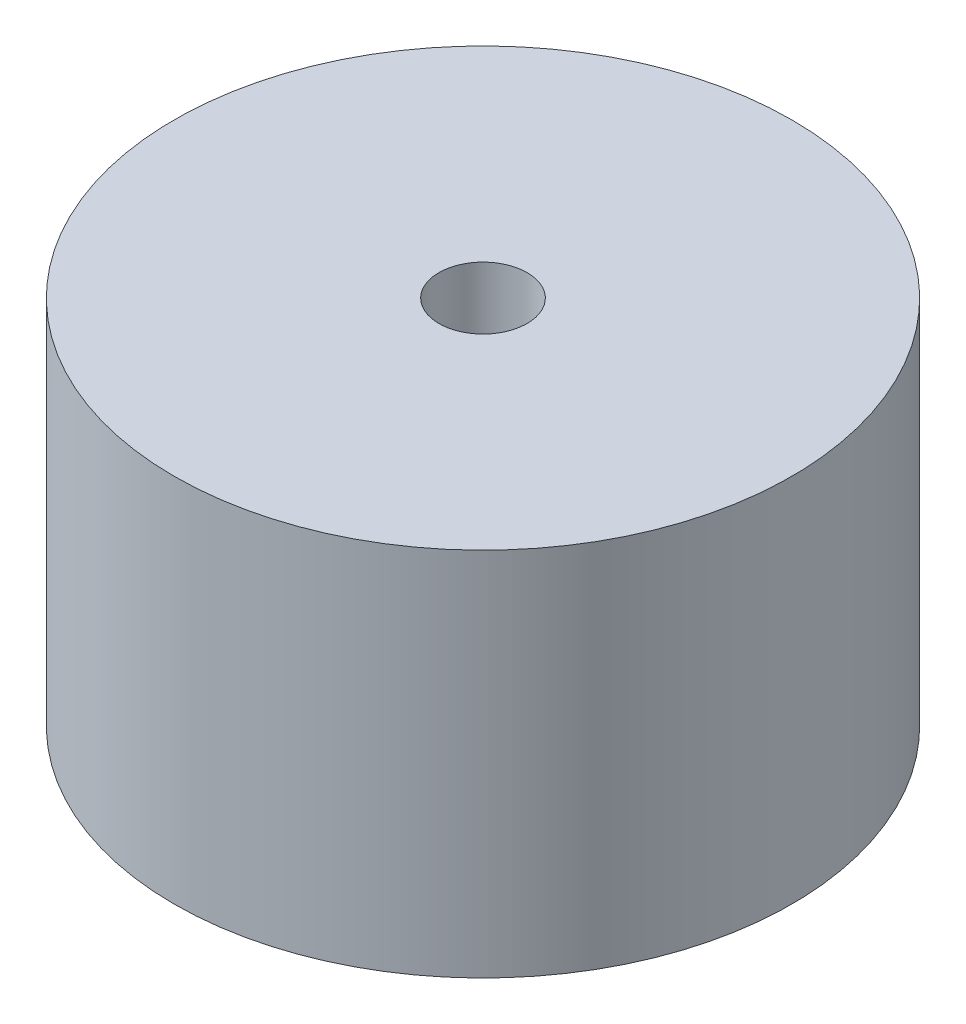
ISO-10303-21;
HEADER;
FILE_DESCRIPTION(('STEP AP214'),'2;1');
FILE_NAME('part.step','',(''),(''),'','','');
FILE_SCHEMA(('AUTOMOTIVE_DESIGN { 1 0 10303 214 1 1 1 1 }'));
ENDSEC;
DATA;
#1=APPLICATION_CONTEXT('core data for automotive mechanical design processes');
#2=APPLICATION_PROTOCOL_DEFINITION('international standard','automotive_design',2000,#1);
#3=PRODUCT_CONTEXT('',#1,'mechanical');
#4=PRODUCT('Part','Part','',(#3));
#5=PRODUCT_RELATED_PRODUCT_CATEGORY('part','',(#4));
#6=PRODUCT_DEFINITION_FORMATION('','',#4);
#7=PRODUCT_DEFINITION_CONTEXT('part definition',#1,'design');
#8=PRODUCT_DEFINITION('design','',#6,#7);
#9=PRODUCT_DEFINITION_SHAPE('','',#8);
#10=(LENGTH_UNIT() NAMED_UNIT(*) SI_UNIT(.MILLI.,.METRE.));
#11=(NAMED_UNIT(*) PLANE_ANGLE_UNIT() SI_UNIT($,.RADIAN.));
#12=(NAMED_UNIT(*) SI_UNIT($,.STERADIAN.) SOLID_ANGLE_UNIT());
#13=UNCERTAINTY_MEASURE_WITH_UNIT(LENGTH_MEASURE(1.E-05),#10,'distance_accuracy_value','');
#14=(GEOMETRIC_REPRESENTATION_CONTEXT(3) GLOBAL_UNCERTAINTY_ASSIGNED_CONTEXT((#13)) GLOBAL_UNIT_ASSIGNED_CONTEXT((#10,
#11,#12)) REPRESENTATION_CONTEXT('',''));
#15=CARTESIAN_POINT('',(0.,0.,0.));
#16=DIRECTION('',(0.,0.,1.));
#17=DIRECTION('',(1.,0.,0.));
#18=AXIS2_PLACEMENT_3D('',#15,#16,#17);
#19=CARTESIAN_POINT('',(0.489666327297885,21.,0.));
#20=DIRECTION('',(0.,1.,0.));
#21=DIRECTION('',(0.,0.,1.));
#22=AXIS2_PLACEMENT_3D('',#19,#20,#21);
#23=PLANE('',#22);
#24=CARTESIAN_POINT('',(0.489666327297885,21.,0.));
#25=DIRECTION('',(0.,1.,0.));
#26=DIRECTION('',(0.,0.,1.));
#27=AXIS2_PLACEMENT_3D('',#24,#25,#26);
#28=CIRCLE('',#27,17.5);
#29=CARTESIAN_POINT('',(0.489666327297885,21.,-17.5));
#30=VERTEX_POINT('',#29);
#31=EDGE_CURVE('E10',#30,#30,#28,.T.);
#32=ORIENTED_EDGE('',*,*,#31,.T.);
#33=EDGE_LOOP('',(#32));
#34=FACE_BOUND('',#33,.T.);
#35=CARTESIAN_POINT('',(0.489666327297885,21.,0.));
#36=DIRECTION('',(0.,1.,0.));
#37=DIRECTION('',(0.,0.,1.));
#38=AXIS2_PLACEMENT_3D('',#35,#36,#37);
#39=CIRCLE('',#38,2.5);
#40=CARTESIAN_POINT('',(0.489666327297885,21.,-2.5));
#41=VERTEX_POINT('',#40);
#42=EDGE_CURVE('E41',#41,#41,#39,.T.);
#43=ORIENTED_EDGE('',*,*,#42,.F.);
#44=EDGE_LOOP('',(#43));
#45=FACE_BOUND('',#44,.T.);
#46=ADVANCED_FACE('F30',(#34,#45),#23,.T.);
#47=CARTESIAN_POINT('',(0.489666327297885,0.,0.));
#48=DIRECTION('',(0.,1.,0.));
#49=DIRECTION('',(0.,0.,1.));
#50=AXIS2_PLACEMENT_3D('',#47,#48,#49);
#51=PLANE('',#50);
#52=CARTESIAN_POINT('',(0.489666327297885,0.,0.));
#53=DIRECTION('',(0.,1.,0.));
#54=DIRECTION('',(0.,0.,1.));
#55=AXIS2_PLACEMENT_3D('',#52,#53,#54);
#56=CIRCLE('',#55,17.5);
#57=CARTESIAN_POINT('',(0.489666327297885,0.,-17.5));
#58=VERTEX_POINT('',#57);
#59=EDGE_CURVE('E34',#58,#58,#56,.T.);
#60=ORIENTED_EDGE('',*,*,#59,.F.);
#61=EDGE_LOOP('',(#60));
#62=FACE_BOUND('',#61,.T.);
#63=CARTESIAN_POINT('',(0.489666327297885,0.,0.));
#64=DIRECTION('',(0.,1.,0.));
#65=DIRECTION('',(0.,0.,1.));
#66=AXIS2_PLACEMENT_3D('',#63,#64,#65);
#67=CIRCLE('',#66,2.5);
#68=CARTESIAN_POINT('',(0.489666327297885,0.,-2.5));
#69=VERTEX_POINT('',#68);
#70=EDGE_CURVE('E43',#69,#69,#67,.T.);
#71=ORIENTED_EDGE('',*,*,#70,.T.);
#72=EDGE_LOOP('',(#71));
#73=FACE_BOUND('',#72,.T.);
#74=ADVANCED_FACE('F53',(#62,#73),#51,.F.);
#75=CARTESIAN_POINT('',(0.489666327297885,21.,0.));
#76=DIRECTION('',(0.,-1.,0.));
#77=DIRECTION('',(0.,0.,-1.));
#78=AXIS2_PLACEMENT_3D('',#75,#76,#77);
#79=CYLINDRICAL_SURFACE('',#78,17.5);
#80=CARTESIAN_POINT('',(0.489666327297885,21.,-17.5));
#81=CARTESIAN_POINT('',(0.489666327297885,20.78125,-17.5));
#82=CARTESIAN_POINT('',(0.489666327297885,20.5625,-17.5));
#83=CARTESIAN_POINT('',(0.489666327297885,20.125,-17.5));
#84=CARTESIAN_POINT('',(0.489666327297885,19.90625,-17.5));
#85=CARTESIAN_POINT('',(0.489666327297885,19.46875,-17.5));
#86=CARTESIAN_POINT('',(0.489666327297885,19.25,-17.5));
#87=CARTESIAN_POINT('',(0.489666327297885,18.8125,-17.5));
#88=CARTESIAN_POINT('',(0.489666327297885,18.59375,-17.5));
#89=CARTESIAN_POINT('',(0.489666327297885,18.15625,-17.5));
#90=CARTESIAN_POINT('',(0.489666327297885,17.9375,-17.5));
#91=CARTESIAN_POINT('',(0.489666327297885,17.5,-17.5));
#92=CARTESIAN_POINT('',(0.489666327297885,17.28125,-17.5));
#93=CARTESIAN_POINT('',(0.489666327297885,16.84375,-17.5));
#94=CARTESIAN_POINT('',(0.489666327297885,16.625,-17.5));
#95=CARTESIAN_POINT('',(0.489666327297885,16.1875,-17.5));
#96=CARTESIAN_POINT('',(0.489666327297885,15.96875,-17.5));
#97=CARTESIAN_POINT('',(0.489666327297885,15.53125,-17.5));
#98=CARTESIAN_POINT('',(0.489666327297885,15.3125,-17.5));
#99=CARTESIAN_POINT('',(0.489666327297885,14.875,-17.5));
#100=CARTESIAN_POINT('',(0.489666327297885,14.65625,-17.5));
#101=CARTESIAN_POINT('',(0.489666327297885,14.21875,-17.5));
#102=CARTESIAN_POINT('',(0.489666327297885,14.,-17.5));
#103=CARTESIAN_POINT('',(0.489666327297885,13.5625,-17.5));
#104=CARTESIAN_POINT('',(0.489666327297885,13.34375,-17.5));
#105=CARTESIAN_POINT('',(0.489666327297885,12.90625,-17.5));
#106=CARTESIAN_POINT('',(0.489666327297885,12.6875,-17.5));
#107=CARTESIAN_POINT('',(0.489666327297885,12.25,-17.5));
#108=CARTESIAN_POINT('',(0.489666327297885,12.03125,-17.5));
#109=CARTESIAN_POINT('',(0.489666327297885,11.59375,-17.5));
#110=CARTESIAN_POINT('',(0.489666327297885,11.375,-17.5));
#111=CARTESIAN_POINT('',(0.489666327297885,10.9375,-17.5));
#112=CARTESIAN_POINT('',(0.489666327297885,10.71875,-17.5));
#113=CARTESIAN_POINT('',(0.489666327297885,10.28125,-17.5));
#114=CARTESIAN_POINT('',(0.489666327297885,10.0625,-17.5));
#115=CARTESIAN_POINT('',(0.489666327297885,9.625,-17.5));
#116=CARTESIAN_POINT('',(0.489666327297885,9.40625,-17.5));
#117=CARTESIAN_POINT('',(0.489666327297885,8.96875,-17.5));
#118=CARTESIAN_POINT('',(0.489666327297885,8.75,-17.5));
#119=CARTESIAN_POINT('',(0.489666327297885,8.3125,-17.5));
#120=CARTESIAN_POINT('',(0.489666327297885,8.09375,-17.5));
#121=CARTESIAN_POINT('',(0.489666327297885,7.65625,-17.5));
#122=CARTESIAN_POINT('',(0.489666327297885,7.4375,-17.5));
#123=CARTESIAN_POINT('',(0.489666327297885,7.,-17.5));
#124=CARTESIAN_POINT('',(0.489666327297885,6.78125,-17.5));
#125=CARTESIAN_POINT('',(0.489666327297885,6.34375,-17.5));
#126=CARTESIAN_POINT('',(0.489666327297885,6.125,-17.5));
#127=CARTESIAN_POINT('',(0.489666327297885,5.6875,-17.5));
#128=CARTESIAN_POINT('',(0.489666327297885,5.46875,-17.5));
#129=CARTESIAN_POINT('',(0.489666327297885,5.03125,-17.5));
#130=CARTESIAN_POINT('',(0.489666327297885,4.8125,-17.5));
#131=CARTESIAN_POINT('',(0.489666327297885,4.375,-17.5));
#132=CARTESIAN_POINT('',(0.489666327297885,4.15625,-17.5));
#133=CARTESIAN_POINT('',(0.489666327297885,3.71875,-17.5));
#134=CARTESIAN_POINT('',(0.489666327297885,3.5,-17.5));
#135=CARTESIAN_POINT('',(0.489666327297885,3.0625,-17.5));
#136=CARTESIAN_POINT('',(0.489666327297885,2.84375,-17.5));
#137=CARTESIAN_POINT('',(0.489666327297885,2.40625,-17.5));
#138=CARTESIAN_POINT('',(0.489666327297885,2.1875,-17.5));
#139=CARTESIAN_POINT('',(0.489666327297885,1.75,-17.5));
#140=CARTESIAN_POINT('',(0.489666327297885,1.53125,-17.5));
#141=CARTESIAN_POINT('',(0.489666327297885,1.09375,-17.5));
#142=CARTESIAN_POINT('',(0.489666327297885,0.875000000000001,-17.5));
#143=CARTESIAN_POINT('',(0.489666327297885,0.4375,-17.5));
#144=CARTESIAN_POINT('',(0.489666327297885,0.21875,-17.5));
#145=CARTESIAN_POINT('',(0.489666327297885,0.,-17.5));
#146=B_SPLINE_CURVE_WITH_KNOTS('',3,(#80,#81,#82,#83,#84,#85,#86,#87,#88,#89,#90,#91,#92,#93,
#94,#95,#96,#97,#98,#99,#100,#101,#102,#103,#104,#105,#106,#107,#108,#109,#110,#111,#112,#113,
#114,#115,#116,#117,#118,#119,#120,#121,#122,#123,#124,#125,#126,#127,#128,#129,#130,#131,#132,
#133,#134,#135,#136,#137,#138,#139,#140,#141,#142,#143,#144,#145),.UNSPECIFIED.,.F.,.F.,(4,2,2,
2,2,2,2,2,2,2,2,2,2,2,2,2,2,2,2,2,2,2,2,2,2,2,2,2,2,2,2,2,4),(0.,0.656249999999997,1.3125,
1.96875,2.625,3.28125,3.9375,4.59375,5.25,5.90625,6.5625,7.21875,7.875,8.53125,9.1875,9.84375,
10.5,11.15625,11.8125,12.46875,13.125,13.78125,14.4375,15.09375,15.75,16.40625,17.0625,17.71875,
18.375,19.03125,19.6875,20.34375,21.),.UNSPECIFIED.);
#147=EDGE_CURVE('BSEAM32',#30,#58,#146,.T.);
#148=ORIENTED_EDGE('',*,*,#31,.F.);
#149=ORIENTED_EDGE('',*,*,#59,.T.);
#150=ORIENTED_EDGE('',*,*,#147,.T.);
#151=ORIENTED_EDGE('',*,*,#147,.F.);
#152=EDGE_LOOP('',(#148,#150,#149,#151));
#153=FACE_BOUND('',#152,.T.);
#154=ADVANCED_FACE('F32',(#153),#79,.T.);
#155=CARTESIAN_POINT('',(0.489666327297885,21.,0.));
#156=DIRECTION('',(0.,-1.,0.));
#157=DIRECTION('',(0.,0.,-1.));
#158=AXIS2_PLACEMENT_3D('',#155,#156,#157);
#159=CYLINDRICAL_SURFACE('',#158,2.5);
#160=CARTESIAN_POINT('',(0.489666327297885,21.,-2.5));
#161=CARTESIAN_POINT('',(0.489666327297885,20.78125,-2.5));
#162=CARTESIAN_POINT('',(0.489666327297885,20.5625,-2.5));
#163=CARTESIAN_POINT('',(0.489666327297885,20.125,-2.5));
#164=CARTESIAN_POINT('',(0.489666327297885,19.90625,-2.5));
#165=CARTESIAN_POINT('',(0.489666327297885,19.46875,-2.5));
#166=CARTESIAN_POINT('',(0.489666327297885,19.25,-2.5));
#167=CARTESIAN_POINT('',(0.489666327297885,18.8125,-2.5));
#168=CARTESIAN_POINT('',(0.489666327297885,18.59375,-2.5));
#169=CARTESIAN_POINT('',(0.489666327297885,18.15625,-2.5));
#170=CARTESIAN_POINT('',(0.489666327297885,17.9375,-2.5));
#171=CARTESIAN_POINT('',(0.489666327297885,17.5,-2.5));
#172=CARTESIAN_POINT('',(0.489666327297885,17.28125,-2.5));
#173=CARTESIAN_POINT('',(0.489666327297885,16.84375,-2.5));
#174=CARTESIAN_POINT('',(0.489666327297885,16.625,-2.5));
#175=CARTESIAN_POINT('',(0.489666327297885,16.1875,-2.5));
#176=CARTESIAN_POINT('',(0.489666327297885,15.96875,-2.5));
#177=CARTESIAN_POINT('',(0.489666327297885,15.53125,-2.5));
#178=CARTESIAN_POINT('',(0.489666327297885,15.3125,-2.5));
#179=CARTESIAN_POINT('',(0.489666327297885,14.875,-2.5));
#180=CARTESIAN_POINT('',(0.489666327297885,14.65625,-2.5));
#181=CARTESIAN_POINT('',(0.489666327297885,14.21875,-2.5));
#182=CARTESIAN_POINT('',(0.489666327297885,14.,-2.5));
#183=CARTESIAN_POINT('',(0.489666327297885,13.5625,-2.5));
#184=CARTESIAN_POINT('',(0.489666327297885,13.34375,-2.5));
#185=CARTESIAN_POINT('',(0.489666327297885,12.90625,-2.5));
#186=CARTESIAN_POINT('',(0.489666327297885,12.6875,-2.5));
#187=CARTESIAN_POINT('',(0.489666327297885,12.25,-2.5));
#188=CARTESIAN_POINT('',(0.489666327297885,12.03125,-2.5));
#189=CARTESIAN_POINT('',(0.489666327297885,11.59375,-2.5));
#190=CARTESIAN_POINT('',(0.489666327297885,11.375,-2.5));
#191=CARTESIAN_POINT('',(0.489666327297885,10.9375,-2.5));
#192=CARTESIAN_POINT('',(0.489666327297885,10.71875,-2.5));
#193=CARTESIAN_POINT('',(0.489666327297885,10.28125,-2.5));
#194=CARTESIAN_POINT('',(0.489666327297885,10.0625,-2.5));
#195=CARTESIAN_POINT('',(0.489666327297885,9.625,-2.5));
#196=CARTESIAN_POINT('',(0.489666327297885,9.40625,-2.5));
#197=CARTESIAN_POINT('',(0.489666327297885,8.96875,-2.5));
#198=CARTESIAN_POINT('',(0.489666327297885,8.75,-2.5));
#199=CARTESIAN_POINT('',(0.489666327297885,8.3125,-2.5));
#200=CARTESIAN_POINT('',(0.489666327297885,8.09375,-2.5));
#201=CARTESIAN_POINT('',(0.489666327297885,7.65625,-2.5));
#202=CARTESIAN_POINT('',(0.489666327297885,7.4375,-2.5));
#203=CARTESIAN_POINT('',(0.489666327297885,7.,-2.5));
#204=CARTESIAN_POINT('',(0.489666327297885,6.78125,-2.5));
#205=CARTESIAN_POINT('',(0.489666327297885,6.34375,-2.5));
#206=CARTESIAN_POINT('',(0.489666327297885,6.125,-2.5));
#207=CARTESIAN_POINT('',(0.489666327297885,5.6875,-2.5));
#208=CARTESIAN_POINT('',(0.489666327297885,5.46875,-2.5));
#209=CARTESIAN_POINT('',(0.489666327297885,5.03125,-2.5));
#210=CARTESIAN_POINT('',(0.489666327297885,4.8125,-2.5));
#211=CARTESIAN_POINT('',(0.489666327297885,4.375,-2.5));
#212=CARTESIAN_POINT('',(0.489666327297885,4.15625,-2.5));
#213=CARTESIAN_POINT('',(0.489666327297885,3.71875,-2.5));
#214=CARTESIAN_POINT('',(0.489666327297885,3.5,-2.5));
#215=CARTESIAN_POINT('',(0.489666327297885,3.0625,-2.5));
#216=CARTESIAN_POINT('',(0.489666327297885,2.84375,-2.5));
#217=CARTESIAN_POINT('',(0.489666327297885,2.40625,-2.5));
#218=CARTESIAN_POINT('',(0.489666327297885,2.1875,-2.5));
#219=CARTESIAN_POINT('',(0.489666327297885,1.75,-2.5));
#220=CARTESIAN_POINT('',(0.489666327297885,1.53125,-2.5));
#221=CARTESIAN_POINT('',(0.489666327297885,1.09375,-2.5));
#222=CARTESIAN_POINT('',(0.489666327297885,0.875000000000001,-2.5));
#223=CARTESIAN_POINT('',(0.489666327297885,0.4375,-2.5));
#224=CARTESIAN_POINT('',(0.489666327297885,0.21875,-2.5));
#225=CARTESIAN_POINT('',(0.489666327297885,0.,-2.5));
#226=B_SPLINE_CURVE_WITH_KNOTS('',3,(#160,#161,#162,#163,#164,#165,#166,#167,#168,#169,#170,
#171,#172,#173,#174,#175,#176,#177,#178,#179,#180,#181,#182,#183,#184,#185,#186,#187,#188,#189,
#190,#191,#192,#193,#194,#195,#196,#197,#198,#199,#200,#201,#202,#203,#204,#205,#206,#207,#208,
#209,#210,#211,#212,#213,#214,#215,#216,#217,#218,#219,#220,#221,#222,#223,#224,#225),
.UNSPECIFIED.,.F.,.F.,(4,2,2,2,2,2,2,2,2,2,2,2,2,2,2,2,2,2,2,2,2,2,2,2,2,2,2,2,2,2,2,2,4),(0.,
0.656250000000001,1.3125,1.96875,2.625,3.28125,3.9375,4.59375,5.25,5.90625,6.5625,7.21875,7.875,
8.53125,9.1875,9.84375,10.5,11.15625,11.8125,12.46875,13.125,13.78125,14.4375,15.09375,15.75,
16.40625,17.0625,17.71875,18.375,19.03125,19.6875,20.34375,21.),.UNSPECIFIED.);
#227=EDGE_CURVE('BSEAM49',#41,#69,#226,.T.);
#228=ORIENTED_EDGE('',*,*,#42,.T.);
#229=ORIENTED_EDGE('',*,*,#70,.F.);
#230=ORIENTED_EDGE('',*,*,#227,.T.);
#231=ORIENTED_EDGE('',*,*,#227,.F.);
#232=EDGE_LOOP('',(#228,#230,#229,#231));
#233=FACE_BOUND('',#232,.T.);
#234=ADVANCED_FACE('F49',(#233),#159,.F.);
#235=CLOSED_SHELL('',(#46,#74,#154,#234));
#236=MANIFOLD_SOLID_BREP('B2',#235);
#237=ADVANCED_BREP_SHAPE_REPRESENTATION('',(#18,#236),#14);
#238=SHAPE_DEFINITION_REPRESENTATION(#9,#237);
ENDSEC;
END-ISO-10303-21;
